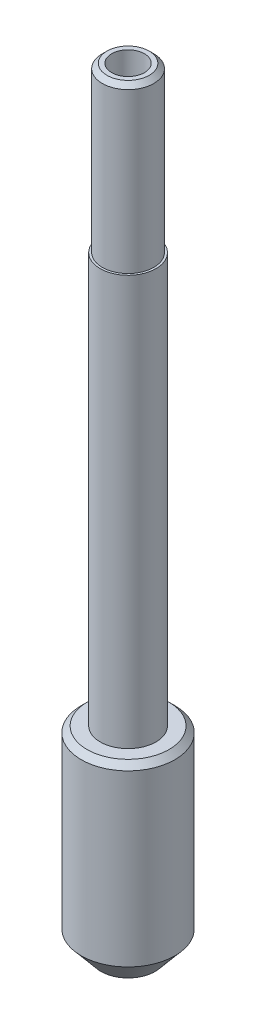
ISO-10303-21;
HEADER;
FILE_DESCRIPTION(('STEP AP214'),'2;1');
FILE_NAME('part.step','',(''),(''),'','','');
FILE_SCHEMA(('AUTOMOTIVE_DESIGN { 1 0 10303 214 1 1 1 1 }'));
ENDSEC;
DATA;
#1=APPLICATION_CONTEXT('core data for automotive mechanical design processes');
#2=APPLICATION_PROTOCOL_DEFINITION('international standard','automotive_design',2000,#1);
#3=PRODUCT_CONTEXT('',#1,'mechanical');
#4=PRODUCT('Part','Part','',(#3));
#5=PRODUCT_RELATED_PRODUCT_CATEGORY('part','',(#4));
#6=PRODUCT_DEFINITION_FORMATION('','',#4);
#7=PRODUCT_DEFINITION_CONTEXT('part definition',#1,'design');
#8=PRODUCT_DEFINITION('design','',#6,#7);
#9=PRODUCT_DEFINITION_SHAPE('','',#8);
#10=(LENGTH_UNIT() NAMED_UNIT(*) SI_UNIT(.MILLI.,.METRE.));
#11=(NAMED_UNIT(*) PLANE_ANGLE_UNIT() SI_UNIT($,.RADIAN.));
#12=(NAMED_UNIT(*) SI_UNIT($,.STERADIAN.) SOLID_ANGLE_UNIT());
#13=UNCERTAINTY_MEASURE_WITH_UNIT(LENGTH_MEASURE(1.E-05),#10,'distance_accuracy_value','');
#14=(GEOMETRIC_REPRESENTATION_CONTEXT(3) GLOBAL_UNCERTAINTY_ASSIGNED_CONTEXT((#13)) GLOBAL_UNIT_ASSIGNED_CONTEXT((#10,
#11,#12)) REPRESENTATION_CONTEXT('',''));
#15=CARTESIAN_POINT('',(0.,0.,0.));
#16=DIRECTION('',(0.,0.,1.));
#17=DIRECTION('',(1.,0.,0.));
#18=AXIS2_PLACEMENT_3D('',#15,#16,#17);
#19=CARTESIAN_POINT('',(0.7,29.,0.));
#20=DIRECTION('',(0.,1.,0.));
#21=DIRECTION('',(-1.,0.,0.));
#22=AXIS2_PLACEMENT_3D('',#19,#20,#21);
#23=PLANE('',#22);
#24=CARTESIAN_POINT('',(0.,29.,0.));
#25=DIRECTION('',(0.,-1.,0.));
#26=DIRECTION('',(1.,0.,0.));
#27=AXIS2_PLACEMENT_3D('',#24,#25,#26);
#28=CIRCLE('',#27,0.699999999999995);
#29=CARTESIAN_POINT('',(0.699999999999999,29.,0.));
#30=VERTEX_POINT('',#29);
#31=EDGE_CURVE('E17',#30,#30,#28,.F.);
#32=ORIENTED_EDGE('',*,*,#31,.T.);
#33=EDGE_LOOP('',(#32));
#34=FACE_BOUND('',#33,.T.);
#35=ADVANCED_FACE('F14',(#34),#23,.T.);
#36=CARTESIAN_POINT('',(0.,0.,0.));
#37=DIRECTION('',(0.,-1.,0.));
#38=DIRECTION('',(1.,0.,0.));
#39=AXIS2_PLACEMENT_3D('',#36,#37,#38);
#40=CYLINDRICAL_SURFACE('',#39,0.699999999999995);
#41=ORIENTED_EDGE('',*,*,#31,.F.);
#42=EDGE_LOOP('',(#41));
#43=FACE_BOUND('',#42,.T.);
#44=CARTESIAN_POINT('',(0.,33.,0.));
#45=DIRECTION('',(0.,-1.,0.));
#46=DIRECTION('',(1.,0.,0.));
#47=AXIS2_PLACEMENT_3D('',#44,#45,#46);
#48=CIRCLE('',#47,0.699999999999995);
#49=CARTESIAN_POINT('',(0.7,33.,0.));
#50=VERTEX_POINT('',#49);
#51=EDGE_CURVE('E43',#50,#50,#48,.T.);
#52=ORIENTED_EDGE('',*,*,#51,.F.);
#53=EDGE_LOOP('',(#52));
#54=FACE_BOUND('',#53,.T.);
#55=ADVANCED_FACE('F51',(#43,#54),#40,.F.);
#56=CARTESIAN_POINT('',(0.,0.,0.));
#57=DIRECTION('',(0.,-1.,0.));
#58=DIRECTION('',(1.,0.,0.));
#59=AXIS2_PLACEMENT_3D('',#56,#57,#58);
#60=PLANE('',#59);
#61=CARTESIAN_POINT('',(0.,0.,0.));
#62=DIRECTION('',(0.,1.,0.));
#63=DIRECTION('',(-1.,0.,0.));
#64=AXIS2_PLACEMENT_3D('',#61,#62,#63);
#65=CIRCLE('',#64,1.16090036883164);
#66=CARTESIAN_POINT('',(-1.16090036883164,0.,0.));
#67=VERTEX_POINT('',#66);
#68=EDGE_CURVE('E41',#67,#67,#65,.T.);
#69=ORIENTED_EDGE('',*,*,#68,.F.);
#70=EDGE_LOOP('',(#69));
#71=FACE_BOUND('',#70,.T.);
#72=ADVANCED_FACE('F54',(#71),#60,.T.);
#73=CARTESIAN_POINT('',(1.1,33.,0.));
#74=DIRECTION('',(0.,1.,0.));
#75=DIRECTION('',(-1.,0.,0.));
#76=AXIS2_PLACEMENT_3D('',#73,#74,#75);
#77=PLANE('',#76);
#78=ORIENTED_EDGE('',*,*,#51,.T.);
#79=EDGE_LOOP('',(#78));
#80=FACE_BOUND('',#79,.T.);
#81=CARTESIAN_POINT('',(0.,33.0000000000155,0.));
#82=DIRECTION('',(0.,-1.,0.));
#83=DIRECTION('',(0.,0.,-1.));
#84=AXIS2_PLACEMENT_3D('',#81,#82,#83);
#85=CIRCLE('',#84,0.900000000058293);
#86=CARTESIAN_POINT('',(0.,33.0000000000155,-0.900000000058293));
#87=VERTEX_POINT('',#86);
#88=EDGE_CURVE('E38',#87,#87,#85,.T.);
#89=ORIENTED_EDGE('',*,*,#88,.F.);
#90=EDGE_LOOP('',(#89));
#91=FACE_BOUND('',#90,.T.);
#92=ADVANCED_FACE('F60',(#80,#91),#77,.T.);
#93=CARTESIAN_POINT('',(0.,0.999999999919509,0.));
#94=DIRECTION('',(0.,1.,0.));
#95=DIRECTION('',(-1.,0.,0.));
#96=AXIS2_PLACEMENT_3D('',#93,#94,#95);
#97=CONICAL_SURFACE('',#96,1.99999999995271,0.69813170080438);
#98=CARTESIAN_POINT('',(0.,0.999999999999995,0.));
#99=DIRECTION('',(0.,-1.,0.));
#100=DIRECTION('',(1.,0.,0.));
#101=AXIS2_PLACEMENT_3D('',#98,#99,#100);
#102=CIRCLE('',#101,2.);
#103=CARTESIAN_POINT('',(2.,0.999999999999994,0.));
#104=VERTEX_POINT('',#103);
#105=EDGE_CURVE('E29',#104,#104,#102,.F.);
#106=ORIENTED_EDGE('',*,*,#105,.F.);
#107=EDGE_LOOP('',(#106));
#108=FACE_BOUND('',#107,.T.);
#109=ORIENTED_EDGE('',*,*,#68,.T.);
#110=EDGE_LOOP('',(#109));
#111=FACE_BOUND('',#110,.T.);
#112=ADVANCED_FACE('F94',(#108,#111),#97,.T.);
#113=CARTESIAN_POINT('',(0.,32.8000000000657,0.));
#114=DIRECTION('',(0.,-1.,0.));
#115=DIRECTION('',(0.,0.,-1.));
#116=AXIS2_PLACEMENT_3D('',#113,#114,#115);
#117=CONICAL_SURFACE('',#116,1.10000000000809,0.785398163397448);
#118=ORIENTED_EDGE('',*,*,#88,.T.);
#119=EDGE_LOOP('',(#118));
#120=FACE_BOUND('',#119,.T.);
#121=CARTESIAN_POINT('',(0.,32.8,0.));
#122=DIRECTION('',(0.,-1.,0.));
#123=DIRECTION('',(1.,0.,0.));
#124=AXIS2_PLACEMENT_3D('',#121,#122,#123);
#125=CIRCLE('',#124,1.1);
#126=CARTESIAN_POINT('',(1.1,32.8,0.));
#127=VERTEX_POINT('',#126);
#128=EDGE_CURVE('E107',#127,#127,#125,.T.);
#129=ORIENTED_EDGE('',*,*,#128,.F.);
#130=EDGE_LOOP('',(#129));
#131=FACE_BOUND('',#130,.T.);
#132=ADVANCED_FACE('F90',(#120,#131),#117,.T.);
#133=CARTESIAN_POINT('',(0.,0.,0.));
#134=DIRECTION('',(0.,-1.,0.));
#135=DIRECTION('',(1.,0.,0.));
#136=AXIS2_PLACEMENT_3D('',#133,#134,#135);
#137=CYLINDRICAL_SURFACE('',#136,2.);
#138=ORIENTED_EDGE('',*,*,#105,.T.);
#139=EDGE_LOOP('',(#138));
#140=FACE_BOUND('',#139,.T.);
#141=CARTESIAN_POINT('',(0.,8.24999999997544,0.));
#142=DIRECTION('',(0.,-1.,0.));
#143=DIRECTION('',(1.,0.,0.));
#144=AXIS2_PLACEMENT_3D('',#141,#142,#143);
#145=CIRCLE('',#144,2.00000000000955);
#146=CARTESIAN_POINT('',(2.00000000000955,8.24999999997544,0.));
#147=VERTEX_POINT('',#146);
#148=EDGE_CURVE('E37',#147,#147,#145,.F.);
#149=ORIENTED_EDGE('',*,*,#148,.F.);
#150=EDGE_LOOP('',(#149));
#151=FACE_BOUND('',#150,.T.);
#152=ADVANCED_FACE('F86',(#140,#151),#137,.T.);
#153=CARTESIAN_POINT('',(0.,0.,0.));
#154=DIRECTION('',(0.,-1.,0.));
#155=DIRECTION('',(1.,0.,0.));
#156=AXIS2_PLACEMENT_3D('',#153,#154,#155);
#157=CYLINDRICAL_SURFACE('',#156,1.1);
#158=ORIENTED_EDGE('',*,*,#128,.T.);
#159=EDGE_LOOP('',(#158));
#160=FACE_BOUND('',#159,.T.);
#161=CARTESIAN_POINT('',(0.,26.,0.));
#162=DIRECTION('',(0.,-1.,0.));
#163=DIRECTION('',(1.,0.,0.));
#164=AXIS2_PLACEMENT_3D('',#161,#162,#163);
#165=CIRCLE('',#164,1.1);
#166=CARTESIAN_POINT('',(1.1,26.,0.));
#167=VERTEX_POINT('',#166);
#168=EDGE_CURVE('E34',#167,#167,#165,.T.);
#169=ORIENTED_EDGE('',*,*,#168,.F.);
#170=EDGE_LOOP('',(#169));
#171=FACE_BOUND('',#170,.T.);
#172=ADVANCED_FACE('F82',(#160,#171),#157,.T.);
#173=CARTESIAN_POINT('',(0.,8.25000000003229,0.));
#174=DIRECTION('',(0.,-1.,0.));
#175=DIRECTION('',(0.,0.,-1.));
#176=AXIS2_PLACEMENT_3D('',#173,#174,#175);
#177=CONICAL_SURFACE('',#176,1.9999999999527,0.785398163511135);
#178=ORIENTED_EDGE('',*,*,#148,.T.);
#179=EDGE_LOOP('',(#178));
#180=FACE_BOUND('',#179,.T.);
#181=CARTESIAN_POINT('',(0.,8.49999999991269,0.));
#182=DIRECTION('',(0.,-1.,0.));
#183=DIRECTION('',(0.,0.,-1.));
#184=AXIS2_PLACEMENT_3D('',#181,#182,#183);
#185=CIRCLE('',#184,1.75000000001546);
#186=CARTESIAN_POINT('',(0.,8.49999999991269,-1.75000000001546));
#187=VERTEX_POINT('',#186);
#188=EDGE_CURVE('E26',#187,#187,#185,.F.);
#189=ORIENTED_EDGE('',*,*,#188,.F.);
#190=EDGE_LOOP('',(#189));
#191=FACE_BOUND('',#190,.T.);
#192=ADVANCED_FACE('F78',(#180,#191),#177,.T.);
#193=CARTESIAN_POINT('',(1.19000000000001,26.,0.));
#194=DIRECTION('',(0.,1.,0.));
#195=DIRECTION('',(-1.,0.,0.));
#196=AXIS2_PLACEMENT_3D('',#193,#194,#195);
#197=PLANE('',#196);
#198=CARTESIAN_POINT('',(0.,26.,0.));
#199=DIRECTION('',(0.,-1.,0.));
#200=DIRECTION('',(1.,0.,0.));
#201=AXIS2_PLACEMENT_3D('',#198,#199,#200);
#202=CIRCLE('',#201,1.19000000000001);
#203=CARTESIAN_POINT('',(1.19000000000001,26.,0.));
#204=VERTEX_POINT('',#203);
#205=EDGE_CURVE('E21',#204,#204,#202,.T.);
#206=ORIENTED_EDGE('',*,*,#205,.F.);
#207=EDGE_LOOP('',(#206));
#208=FACE_BOUND('',#207,.T.);
#209=ORIENTED_EDGE('',*,*,#168,.T.);
#210=EDGE_LOOP('',(#209));
#211=FACE_BOUND('',#210,.T.);
#212=ADVANCED_FACE('F71',(#208,#211),#197,.T.);
#213=CARTESIAN_POINT('',(2.,8.5,0.));
#214=DIRECTION('',(0.,1.,0.));
#215=DIRECTION('',(-1.,0.,0.));
#216=AXIS2_PLACEMENT_3D('',#213,#214,#215);
#217=PLANE('',#216);
#218=CARTESIAN_POINT('',(0.,8.5,0.));
#219=DIRECTION('',(0.,-1.,0.));
#220=DIRECTION('',(1.,0.,0.));
#221=AXIS2_PLACEMENT_3D('',#218,#219,#220);
#222=CIRCLE('',#221,1.19000000000001);
#223=CARTESIAN_POINT('',(1.19000000000001,8.5,0.));
#224=VERTEX_POINT('',#223);
#225=EDGE_CURVE('E10',#224,#224,#222,.F.);
#226=ORIENTED_EDGE('',*,*,#225,.F.);
#227=EDGE_LOOP('',(#226));
#228=FACE_BOUND('',#227,.T.);
#229=ORIENTED_EDGE('',*,*,#188,.T.);
#230=EDGE_LOOP('',(#229));
#231=FACE_BOUND('',#230,.T.);
#232=ADVANCED_FACE('F66',(#228,#231),#217,.T.);
#233=CARTESIAN_POINT('',(0.,0.,0.));
#234=DIRECTION('',(0.,-1.,0.));
#235=DIRECTION('',(1.,0.,0.));
#236=AXIS2_PLACEMENT_3D('',#233,#234,#235);
#237=CYLINDRICAL_SURFACE('',#236,1.19000000000001);
#238=ORIENTED_EDGE('',*,*,#225,.T.);
#239=EDGE_LOOP('',(#238));
#240=FACE_BOUND('',#239,.T.);
#241=ORIENTED_EDGE('',*,*,#205,.T.);
#242=EDGE_LOOP('',(#241));
#243=FACE_BOUND('',#242,.T.);
#244=ADVANCED_FACE('F64',(#240,#243),#237,.T.);
#245=CLOSED_SHELL('',(#35,#55,#72,#92,#112,#132,#152,#172,#192,#212,#232,#244));
#246=MANIFOLD_SOLID_BREP('B1',#245);
#247=ADVANCED_BREP_SHAPE_REPRESENTATION('',(#18,#246),#14);
#248=SHAPE_DEFINITION_REPRESENTATION(#9,#247);
ENDSEC;
END-ISO-10303-21;
